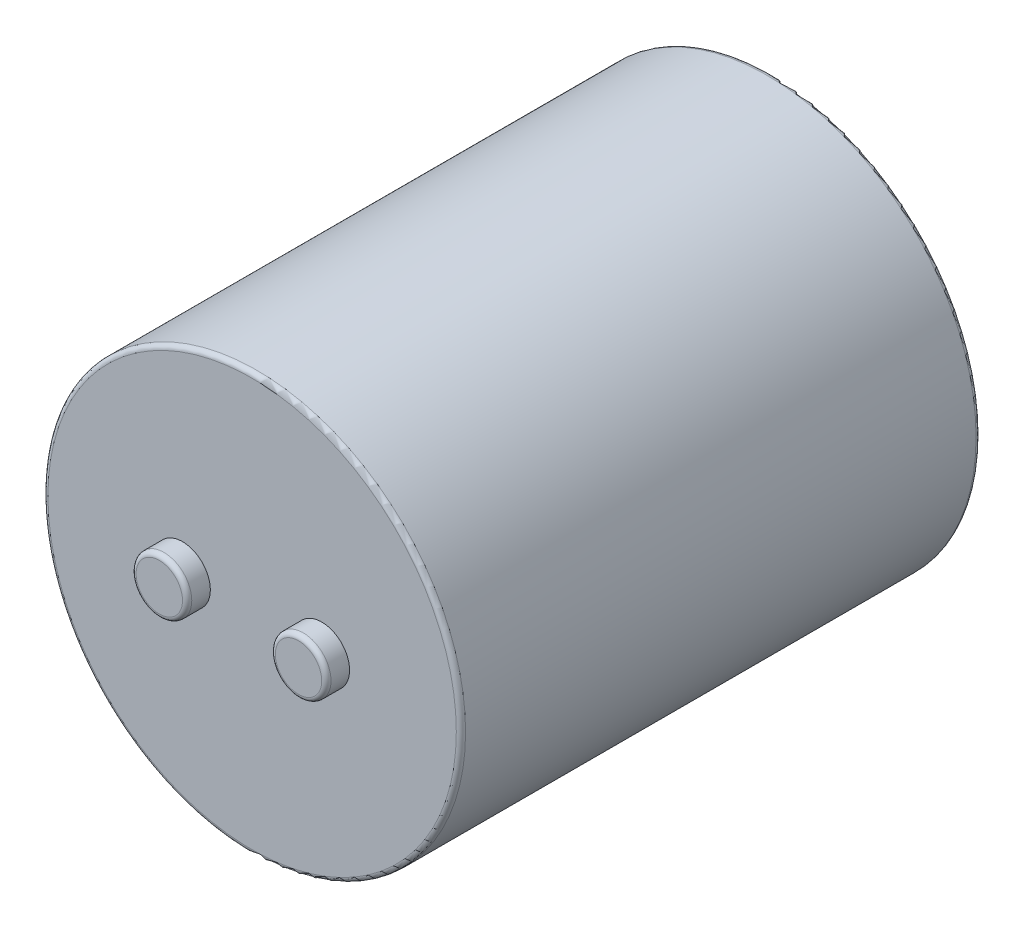
ISO-10303-21;
HEADER;
FILE_DESCRIPTION(('STEP AP214'),'2;1');
FILE_NAME('part.step','',(''),(''),'','','');
FILE_SCHEMA(('AUTOMOTIVE_DESIGN { 1 0 10303 214 1 1 1 1 }'));
ENDSEC;
DATA;
#1=APPLICATION_CONTEXT('core data for automotive mechanical design processes');
#2=APPLICATION_PROTOCOL_DEFINITION('international standard','automotive_design',2000,#1);
#3=PRODUCT_CONTEXT('',#1,'mechanical');
#4=PRODUCT('Part','Part','',(#3));
#5=PRODUCT_RELATED_PRODUCT_CATEGORY('part','',(#4));
#6=PRODUCT_DEFINITION_FORMATION('','',#4);
#7=PRODUCT_DEFINITION_CONTEXT('part definition',#1,'design');
#8=PRODUCT_DEFINITION('design','',#6,#7);
#9=PRODUCT_DEFINITION_SHAPE('','',#8);
#10=(LENGTH_UNIT() NAMED_UNIT(*) SI_UNIT(.MILLI.,.METRE.));
#11=(NAMED_UNIT(*) PLANE_ANGLE_UNIT() SI_UNIT($,.RADIAN.));
#12=(NAMED_UNIT(*) SI_UNIT($,.STERADIAN.) SOLID_ANGLE_UNIT());
#13=UNCERTAINTY_MEASURE_WITH_UNIT(LENGTH_MEASURE(1.E-05),#10,'distance_accuracy_value','');
#14=(GEOMETRIC_REPRESENTATION_CONTEXT(3) GLOBAL_UNCERTAINTY_ASSIGNED_CONTEXT((#13)) GLOBAL_UNIT_ASSIGNED_CONTEXT((#10,
#11,#12)) REPRESENTATION_CONTEXT('',''));
#15=CARTESIAN_POINT('',(0.,0.,0.));
#16=DIRECTION('',(0.,0.,1.));
#17=DIRECTION('',(1.,0.,0.));
#18=AXIS2_PLACEMENT_3D('',#15,#16,#17);
#19=CARTESIAN_POINT('',(15.,0.,117.));
#20=DIRECTION('',(0.,0.,-1.));
#21=DIRECTION('',(-1.,0.,0.));
#22=AXIS2_PLACEMENT_3D('',#19,#20,#21);
#23=PLANE('',#22);
#24=CARTESIAN_POINT('',(15.,0.,117.));
#25=DIRECTION('',(0.,0.,-1.));
#26=DIRECTION('',(1.,0.,0.));
#27=AXIS2_PLACEMENT_3D('',#24,#25,#26);
#28=CIRCLE('',#27,5.);
#29=CARTESIAN_POINT('',(20.,0.,117.));
#30=VERTEX_POINT('',#29);
#31=EDGE_CURVE('E166',#30,#30,#28,.T.);
#32=ORIENTED_EDGE('',*,*,#31,.F.);
#33=EDGE_LOOP('',(#32));
#34=FACE_BOUND('',#33,.T.);
#35=ADVANCED_FACE('F15',(#34),#23,.F.);
#36=CARTESIAN_POINT('',(-15.,0.,117.));
#37=DIRECTION('',(0.,0.,-1.));
#38=DIRECTION('',(-1.,0.,0.));
#39=AXIS2_PLACEMENT_3D('',#36,#37,#38);
#40=PLANE('',#39);
#41=CARTESIAN_POINT('',(-15.,0.,117.));
#42=DIRECTION('',(0.,0.,-1.));
#43=DIRECTION('',(1.,0.,0.));
#44=AXIS2_PLACEMENT_3D('',#41,#42,#43);
#45=CIRCLE('',#44,5.);
#46=CARTESIAN_POINT('',(-10.,0.,117.));
#47=VERTEX_POINT('',#46);
#48=EDGE_CURVE('E115',#47,#47,#45,.T.);
#49=ORIENTED_EDGE('',*,*,#48,.F.);
#50=EDGE_LOOP('',(#49));
#51=FACE_BOUND('',#50,.T.);
#52=ADVANCED_FACE('F119',(#51),#40,.F.);
#53=CARTESIAN_POINT('',(15.,0.,116.));
#54=DIRECTION('',(0.,0.,-1.));
#55=DIRECTION('',(-1.,0.,0.));
#56=AXIS2_PLACEMENT_3D('',#53,#54,#55);
#57=TOROIDAL_SURFACE('',#56,5.,1.);
#58=CARTESIAN_POINT('',(15.,0.,116.));
#59=DIRECTION('',(0.,0.,1.));
#60=DIRECTION('',(1.,0.,0.));
#61=AXIS2_PLACEMENT_3D('',#58,#59,#60);
#62=CIRCLE('',#61,6.);
#63=CARTESIAN_POINT('',(21.,0.,116.));
#64=VERTEX_POINT('',#63);
#65=EDGE_CURVE('E182',#64,#64,#62,.F.);
#66=ORIENTED_EDGE('',*,*,#65,.F.);
#67=EDGE_LOOP('',(#66));
#68=FACE_BOUND('',#67,.T.);
#69=ORIENTED_EDGE('',*,*,#31,.T.);
#70=EDGE_LOOP('',(#69));
#71=FACE_BOUND('',#70,.T.);
#72=ADVANCED_FACE('F100',(#68,#71),#57,.T.);
#73=CARTESIAN_POINT('',(-15.,0.,116.));
#74=DIRECTION('',(0.,0.,-1.));
#75=DIRECTION('',(-1.,0.,0.));
#76=AXIS2_PLACEMENT_3D('',#73,#74,#75);
#77=TOROIDAL_SURFACE('',#76,5.,1.);
#78=CARTESIAN_POINT('',(-15.,0.,116.));
#79=DIRECTION('',(0.,0.,1.));
#80=DIRECTION('',(1.,0.,0.));
#81=AXIS2_PLACEMENT_3D('',#78,#79,#80);
#82=CIRCLE('',#81,6.);
#83=CARTESIAN_POINT('',(-9.,0.,116.));
#84=VERTEX_POINT('',#83);
#85=EDGE_CURVE('E152',#84,#84,#82,.F.);
#86=ORIENTED_EDGE('',*,*,#85,.F.);
#87=EDGE_LOOP('',(#86));
#88=FACE_BOUND('',#87,.T.);
#89=ORIENTED_EDGE('',*,*,#48,.T.);
#90=EDGE_LOOP('',(#89));
#91=FACE_BOUND('',#90,.T.);
#92=ADVANCED_FACE('F94',(#88,#91),#77,.T.);
#93=CARTESIAN_POINT('',(15.,0.,112.));
#94=DIRECTION('',(0.,0.,1.));
#95=DIRECTION('',(1.,0.,0.));
#96=AXIS2_PLACEMENT_3D('',#93,#94,#95);
#97=CYLINDRICAL_SURFACE('',#96,6.);
#98=ORIENTED_EDGE('',*,*,#65,.T.);
#99=EDGE_LOOP('',(#98));
#100=FACE_BOUND('',#99,.T.);
#101=CARTESIAN_POINT('',(15.,0.,112.));
#102=DIRECTION('',(0.,0.,1.));
#103=DIRECTION('',(1.,0.,0.));
#104=AXIS2_PLACEMENT_3D('',#101,#102,#103);
#105=CIRCLE('',#104,6.);
#106=CARTESIAN_POINT('',(21.,0.,112.));
#107=VERTEX_POINT('',#106);
#108=EDGE_CURVE('E19',#107,#107,#105,.T.);
#109=ORIENTED_EDGE('',*,*,#108,.T.);
#110=EDGE_LOOP('',(#109));
#111=FACE_BOUND('',#110,.T.);
#112=ADVANCED_FACE('F90',(#100,#111),#97,.T.);
#113=CARTESIAN_POINT('',(-15.,0.,112.));
#114=DIRECTION('',(0.,0.,1.));
#115=DIRECTION('',(1.,0.,0.));
#116=AXIS2_PLACEMENT_3D('',#113,#114,#115);
#117=CYLINDRICAL_SURFACE('',#116,6.);
#118=ORIENTED_EDGE('',*,*,#85,.T.);
#119=EDGE_LOOP('',(#118));
#120=FACE_BOUND('',#119,.T.);
#121=CARTESIAN_POINT('',(-15.,0.,112.));
#122=DIRECTION('',(0.,0.,1.));
#123=DIRECTION('',(1.,0.,0.));
#124=AXIS2_PLACEMENT_3D('',#121,#122,#123);
#125=CIRCLE('',#124,6.);
#126=CARTESIAN_POINT('',(-9.,0.,112.));
#127=VERTEX_POINT('',#126);
#128=EDGE_CURVE('E147',#127,#127,#125,.T.);
#129=ORIENTED_EDGE('',*,*,#128,.T.);
#130=EDGE_LOOP('',(#129));
#131=FACE_BOUND('',#130,.T.);
#132=ADVANCED_FACE('F86',(#120,#131),#117,.T.);
#133=CARTESIAN_POINT('',(0.,0.,0.));
#134=DIRECTION('',(0.,0.,-1.));
#135=DIRECTION('',(-1.,0.,0.));
#136=AXIS2_PLACEMENT_3D('',#133,#134,#135);
#137=PLANE('',#136);
#138=CARTESIAN_POINT('',(0.,0.,0.));
#139=DIRECTION('',(0.,0.,1.));
#140=DIRECTION('',(1.,0.,0.));
#141=AXIS2_PLACEMENT_3D('',#138,#139,#140);
#142=CIRCLE('',#141,44.);
#143=CARTESIAN_POINT('',(44.,0.,0.));
#144=VERTEX_POINT('',#143);
#145=EDGE_CURVE('E70',#144,#144,#142,.T.);
#146=ORIENTED_EDGE('',*,*,#145,.F.);
#147=EDGE_LOOP('',(#146));
#148=FACE_BOUND('',#147,.T.);
#149=ADVANCED_FACE('F76',(#148),#137,.T.);
#150=CARTESIAN_POINT('',(0.,0.,112.));
#151=DIRECTION('',(0.,0.,-1.));
#152=DIRECTION('',(-1.,0.,0.));
#153=AXIS2_PLACEMENT_3D('',#150,#151,#152);
#154=PLANE('',#153);
#155=ORIENTED_EDGE('',*,*,#128,.F.);
#156=EDGE_LOOP('',(#155));
#157=FACE_BOUND('',#156,.T.);
#158=ORIENTED_EDGE('',*,*,#108,.F.);
#159=EDGE_LOOP('',(#158));
#160=FACE_BOUND('',#159,.T.);
#161=CARTESIAN_POINT('',(0.,0.,112.));
#162=DIRECTION('',(0.,0.,-1.));
#163=DIRECTION('',(1.,0.,0.));
#164=AXIS2_PLACEMENT_3D('',#161,#162,#163);
#165=CIRCLE('',#164,44.);
#166=CARTESIAN_POINT('',(44.,0.,112.));
#167=VERTEX_POINT('',#166);
#168=EDGE_CURVE('E32',#167,#167,#165,.T.);
#169=ORIENTED_EDGE('',*,*,#168,.F.);
#170=EDGE_LOOP('',(#169));
#171=FACE_BOUND('',#170,.T.);
#172=ADVANCED_FACE('F85',(#157,#160,#171),#154,.F.);
#173=CARTESIAN_POINT('',(0.,0.,1.));
#174=DIRECTION('',(0.,0.,-1.));
#175=DIRECTION('',(-1.,0.,0.));
#176=AXIS2_PLACEMENT_3D('',#173,#174,#175);
#177=TOROIDAL_SURFACE('',#176,44.,1.);
#178=ORIENTED_EDGE('',*,*,#145,.T.);
#179=EDGE_LOOP('',(#178));
#180=FACE_BOUND('',#179,.T.);
#181=CARTESIAN_POINT('',(0.,0.,1.));
#182=DIRECTION('',(0.,0.,1.));
#183=DIRECTION('',(1.,0.,0.));
#184=AXIS2_PLACEMENT_3D('',#181,#182,#183);
#185=CIRCLE('',#184,45.);
#186=CARTESIAN_POINT('',(45.,0.,1.));
#187=VERTEX_POINT('',#186);
#188=EDGE_CURVE('E24',#187,#187,#185,.T.);
#189=ORIENTED_EDGE('',*,*,#188,.F.);
#190=EDGE_LOOP('',(#189));
#191=FACE_BOUND('',#190,.T.);
#192=ADVANCED_FACE('F50',(#180,#191),#177,.T.);
#193=CARTESIAN_POINT('',(0.,0.,111.));
#194=DIRECTION('',(0.,0.,-1.));
#195=DIRECTION('',(-1.,0.,0.));
#196=AXIS2_PLACEMENT_3D('',#193,#194,#195);
#197=TOROIDAL_SURFACE('',#196,44.,1.);
#198=CARTESIAN_POINT('',(0.,0.,111.));
#199=DIRECTION('',(0.,0.,1.));
#200=DIRECTION('',(1.,0.,0.));
#201=AXIS2_PLACEMENT_3D('',#198,#199,#200);
#202=CIRCLE('',#201,45.);
#203=CARTESIAN_POINT('',(45.,0.,111.));
#204=VERTEX_POINT('',#203);
#205=EDGE_CURVE('E10',#204,#204,#202,.F.);
#206=ORIENTED_EDGE('',*,*,#205,.F.);
#207=EDGE_LOOP('',(#206));
#208=FACE_BOUND('',#207,.T.);
#209=ORIENTED_EDGE('',*,*,#168,.T.);
#210=EDGE_LOOP('',(#209));
#211=FACE_BOUND('',#210,.T.);
#212=ADVANCED_FACE('F44',(#208,#211),#197,.T.);
#213=CARTESIAN_POINT('',(0.,0.,0.));
#214=DIRECTION('',(0.,0.,1.));
#215=DIRECTION('',(1.,0.,0.));
#216=AXIS2_PLACEMENT_3D('',#213,#214,#215);
#217=CYLINDRICAL_SURFACE('',#216,45.);
#218=ORIENTED_EDGE('',*,*,#205,.T.);
#219=EDGE_LOOP('',(#218));
#220=FACE_BOUND('',#219,.T.);
#221=ORIENTED_EDGE('',*,*,#188,.T.);
#222=EDGE_LOOP('',(#221));
#223=FACE_BOUND('',#222,.T.);
#224=ADVANCED_FACE('F49',(#220,#223),#217,.T.);
#225=CLOSED_SHELL('',(#35,#52,#72,#92,#112,#132,#149,#172,#192,#212,#224));
#226=MANIFOLD_SOLID_BREP('B1',#225);
#227=ADVANCED_BREP_SHAPE_REPRESENTATION('',(#18,#226),#14);
#228=SHAPE_DEFINITION_REPRESENTATION(#9,#227);
ENDSEC;
END-ISO-10303-21;
